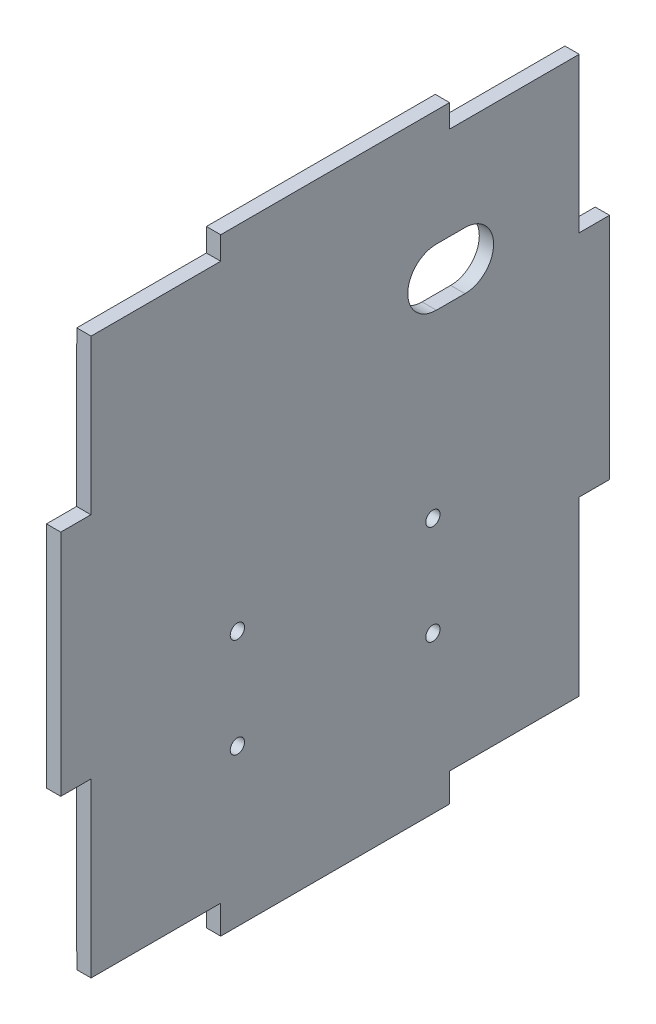
ISO-10303-21;
HEADER;
FILE_DESCRIPTION(('STEP AP214'),'2;1');
FILE_NAME('part.step','',(''),(''),'','','');
FILE_SCHEMA(('AUTOMOTIVE_DESIGN { 1 0 10303 214 1 1 1 1 }'));
ENDSEC;
DATA;
#1=APPLICATION_CONTEXT('core data for automotive mechanical design processes');
#2=APPLICATION_PROTOCOL_DEFINITION('international standard','automotive_design',2000,#1);
#3=PRODUCT_CONTEXT('',#1,'mechanical');
#4=PRODUCT('Part','Part','',(#3));
#5=PRODUCT_RELATED_PRODUCT_CATEGORY('part','',(#4));
#6=PRODUCT_DEFINITION_FORMATION('','',#4);
#7=PRODUCT_DEFINITION_CONTEXT('part definition',#1,'design');
#8=PRODUCT_DEFINITION('design','',#6,#7);
#9=PRODUCT_DEFINITION_SHAPE('','',#8);
#10=(LENGTH_UNIT() NAMED_UNIT(*) SI_UNIT(.MILLI.,.METRE.));
#11=(NAMED_UNIT(*) PLANE_ANGLE_UNIT() SI_UNIT($,.RADIAN.));
#12=(NAMED_UNIT(*) SI_UNIT($,.STERADIAN.) SOLID_ANGLE_UNIT());
#13=UNCERTAINTY_MEASURE_WITH_UNIT(LENGTH_MEASURE(1.E-05),#10,'distance_accuracy_value','');
#14=(GEOMETRIC_REPRESENTATION_CONTEXT(3) GLOBAL_UNCERTAINTY_ASSIGNED_CONTEXT((#13)) GLOBAL_UNIT_ASSIGNED_CONTEXT((#10,
#11,#12)) REPRESENTATION_CONTEXT('',''));
#15=CARTESIAN_POINT('',(0.,0.,0.));
#16=DIRECTION('',(0.,0.,1.));
#17=DIRECTION('',(1.,0.,0.));
#18=AXIS2_PLACEMENT_3D('',#15,#16,#17);
#19=CARTESIAN_POINT('',(377.825,0.066495814032682,54.1515274899939));
#20=DIRECTION('',(0.,0.00122795730759625,0.999999246060141));
#21=DIRECTION('',(0.,-0.999999246060141,0.00122795730759625));
#22=AXIS2_PLACEMENT_3D('',#19,#20,#21);
#23=PLANE('',#22);
#24=DIRECTION('',(0.,-0.999999246060141,0.00122795730759625));
#25=VECTOR('',#24,1.);
#26=CARTESIAN_POINT('',(381.,0.066495814032682,54.1515274899939));
#27=LINE('',#26,#25);
#28=CARTESIAN_POINT('',(381.,-19.5795814483705,54.1756520523223));
#29=VERTEX_POINT('',#28);
#30=CARTESIAN_POINT('',(381.,-53.8928809090593,54.2177873509103));
#31=VERTEX_POINT('',#30);
#32=EDGE_CURVE('E253',#29,#31,#27,.T.);
#33=ORIENTED_EDGE('',*,*,#32,.F.);
#34=DIRECTION('',(1.,0.,0.));
#35=VECTOR('',#34,1.);
#36=CARTESIAN_POINT('',(377.825,-19.5795814483705,54.1756520523223));
#37=LINE('',#36,#35);
#38=CARTESIAN_POINT('',(377.825,-19.5795814483705,54.1756520523223));
#39=VERTEX_POINT('',#38);
#40=EDGE_CURVE('E11',#39,#29,#37,.T.);
#41=ORIENTED_EDGE('',*,*,#40,.F.);
#42=DIRECTION('',(0.,-0.999999246060141,0.00122795730759625));
#43=VECTOR('',#42,1.);
#44=CARTESIAN_POINT('',(377.825,0.066495814032682,54.1515274899939));
#45=LINE('',#44,#43);
#46=CARTESIAN_POINT('',(377.825,-53.8928809090593,54.2177873509103));
#47=VERTEX_POINT('',#46);
#48=EDGE_CURVE('E391',#39,#47,#45,.T.);
#49=ORIENTED_EDGE('',*,*,#48,.T.);
#50=DIRECTION('',(1.,0.,0.));
#51=VECTOR('',#50,1.);
#52=CARTESIAN_POINT('',(377.825,-53.8928809090593,54.2177873509103));
#53=LINE('',#52,#51);
#54=EDGE_CURVE('E348',#47,#31,#53,.T.);
#55=ORIENTED_EDGE('',*,*,#54,.T.);
#56=EDGE_LOOP('',(#33,#41,#49,#55));
#57=FACE_BOUND('',#56,.T.);
#58=ADVANCED_FACE('F35',(#57),#23,.T.);
#59=CARTESIAN_POINT('',(377.825,-19.5795814483705,0.));
#60=DIRECTION('',(0.,-1.,0.));
#61=DIRECTION('',(0.,0.,-1.));
#62=AXIS2_PLACEMENT_3D('',#59,#60,#61);
#63=PLANE('',#62);
#64=DIRECTION('',(0.,0.,-1.));
#65=VECTOR('',#64,1.);
#66=CARTESIAN_POINT('',(381.,-19.5795814483705,0.));
#67=LINE('',#66,#65);
#68=CARTESIAN_POINT('',(381.,-19.5795814483705,25.4));
#69=VERTEX_POINT('',#68);
#70=EDGE_CURVE('E307',#29,#69,#67,.T.);
#71=ORIENTED_EDGE('',*,*,#70,.T.);
#72=DIRECTION('',(1.,0.,0.));
#73=VECTOR('',#72,1.);
#74=CARTESIAN_POINT('',(377.825,-19.5795814483705,25.4));
#75=LINE('',#74,#73);
#76=CARTESIAN_POINT('',(377.825,-19.5795814483705,25.4));
#77=VERTEX_POINT('',#76);
#78=EDGE_CURVE('E45',#77,#69,#75,.T.);
#79=ORIENTED_EDGE('',*,*,#78,.F.);
#80=DIRECTION('',(0.,0.,-1.));
#81=VECTOR('',#80,1.);
#82=CARTESIAN_POINT('',(377.825,-19.5795814483705,0.));
#83=LINE('',#82,#81);
#84=EDGE_CURVE('E213',#39,#77,#83,.T.);
#85=ORIENTED_EDGE('',*,*,#84,.F.);
#86=ORIENTED_EDGE('',*,*,#40,.T.);
#87=EDGE_LOOP('',(#71,#79,#85,#86));
#88=FACE_BOUND('',#87,.T.);
#89=ADVANCED_FACE('F488',(#88),#63,.F.);
#90=CARTESIAN_POINT('',(377.825,0.,25.4));
#91=DIRECTION('',(0.,0.,-1.));
#92=DIRECTION('',(-1.,0.,0.));
#93=AXIS2_PLACEMENT_3D('',#90,#91,#92);
#94=PLANE('',#93);
#95=DIRECTION('',(0.,1.,0.));
#96=VECTOR('',#95,1.);
#97=CARTESIAN_POINT('',(381.,0.,25.4));
#98=LINE('',#97,#96);
#99=CARTESIAN_POINT('',(381.,-14.4809573640672,25.4));
#100=VERTEX_POINT('',#99);
#101=EDGE_CURVE('E130',#69,#100,#98,.T.);
#102=ORIENTED_EDGE('',*,*,#101,.T.);
#103=DIRECTION('',(1.,0.,0.));
#104=VECTOR('',#103,1.);
#105=CARTESIAN_POINT('',(377.825,-14.4809573640672,25.4));
#106=LINE('',#105,#104);
#107=CARTESIAN_POINT('',(377.825,-14.4809573640672,25.4));
#108=VERTEX_POINT('',#107);
#109=EDGE_CURVE('E217',#108,#100,#106,.T.);
#110=ORIENTED_EDGE('',*,*,#109,.F.);
#111=DIRECTION('',(0.,1.,0.));
#112=VECTOR('',#111,1.);
#113=CARTESIAN_POINT('',(377.825,0.,25.4));
#114=LINE('',#113,#112);
#115=EDGE_CURVE('E205',#77,#108,#114,.T.);
#116=ORIENTED_EDGE('',*,*,#115,.F.);
#117=ORIENTED_EDGE('',*,*,#78,.T.);
#118=EDGE_LOOP('',(#102,#110,#116,#117));
#119=FACE_BOUND('',#118,.T.);
#120=ADVANCED_FACE('F218',(#119),#94,.F.);
#121=CARTESIAN_POINT('',(377.825,-14.4809573640672,0.));
#122=DIRECTION('',(0.,1.,0.));
#123=DIRECTION('',(0.,0.,1.));
#124=AXIS2_PLACEMENT_3D('',#121,#122,#123);
#125=PLANE('',#124);
#126=DIRECTION('',(0.,0.,1.));
#127=VECTOR('',#126,1.);
#128=CARTESIAN_POINT('',(381.,-14.4809573640672,0.));
#129=LINE('',#128,#127);
#130=CARTESIAN_POINT('',(381.,-14.4809573640672,-25.4));
#131=VERTEX_POINT('',#130);
#132=EDGE_CURVE('E304',#131,#100,#129,.T.);
#133=ORIENTED_EDGE('',*,*,#132,.F.);
#134=DIRECTION('',(1.,0.,0.));
#135=VECTOR('',#134,1.);
#136=CARTESIAN_POINT('',(377.825,-14.4809573640672,-25.4));
#137=LINE('',#136,#135);
#138=CARTESIAN_POINT('',(377.825,-14.4809573640672,-25.4));
#139=VERTEX_POINT('',#138);
#140=EDGE_CURVE('E221',#139,#131,#137,.T.);
#141=ORIENTED_EDGE('',*,*,#140,.F.);
#142=DIRECTION('',(0.,0.,1.));
#143=VECTOR('',#142,1.);
#144=CARTESIAN_POINT('',(377.825,-14.4809573640672,0.));
#145=LINE('',#144,#143);
#146=EDGE_CURVE('E211',#139,#108,#145,.T.);
#147=ORIENTED_EDGE('',*,*,#146,.T.);
#148=ORIENTED_EDGE('',*,*,#109,.T.);
#149=EDGE_LOOP('',(#133,#141,#147,#148));
#150=FACE_BOUND('',#149,.T.);
#151=ADVANCED_FACE('F223',(#150),#125,.T.);
#152=CARTESIAN_POINT('',(377.825,0.,-25.4));
#153=DIRECTION('',(0.,0.,-1.));
#154=DIRECTION('',(-1.,0.,0.));
#155=AXIS2_PLACEMENT_3D('',#152,#153,#154);
#156=PLANE('',#155);
#157=DIRECTION('',(0.,1.,0.));
#158=VECTOR('',#157,1.);
#159=CARTESIAN_POINT('',(381.,0.,-25.4));
#160=LINE('',#159,#158);
#161=CARTESIAN_POINT('',(381.,-19.5795814483705,-25.4));
#162=VERTEX_POINT('',#161);
#163=EDGE_CURVE('E301',#162,#131,#160,.T.);
#164=ORIENTED_EDGE('',*,*,#163,.F.);
#165=DIRECTION('',(1.,0.,0.));
#166=VECTOR('',#165,1.);
#167=CARTESIAN_POINT('',(377.825,-19.5795814483705,-25.4));
#168=LINE('',#167,#166);
#169=CARTESIAN_POINT('',(377.825,-19.5795814483705,-25.4));
#170=VERTEX_POINT('',#169);
#171=EDGE_CURVE('E312',#170,#162,#168,.T.);
#172=ORIENTED_EDGE('',*,*,#171,.F.);
#173=DIRECTION('',(0.,1.,0.));
#174=VECTOR('',#173,1.);
#175=CARTESIAN_POINT('',(377.825,0.,-25.4));
#176=LINE('',#175,#174);
#177=EDGE_CURVE('E224',#170,#139,#176,.T.);
#178=ORIENTED_EDGE('',*,*,#177,.T.);
#179=ORIENTED_EDGE('',*,*,#140,.T.);
#180=EDGE_LOOP('',(#164,#172,#178,#179));
#181=FACE_BOUND('',#180,.T.);
#182=ADVANCED_FACE('F502',(#181),#156,.T.);
#183=CARTESIAN_POINT('',(377.825,-19.5795814483705,0.));
#184=DIRECTION('',(0.,-1.,0.));
#185=DIRECTION('',(0.,0.,-1.));
#186=AXIS2_PLACEMENT_3D('',#183,#184,#185);
#187=PLANE('',#186);
#188=DIRECTION('',(0.,0.,-1.));
#189=VECTOR('',#188,1.);
#190=CARTESIAN_POINT('',(381.,-19.5795814483705,0.));
#191=LINE('',#190,#189);
#192=CARTESIAN_POINT('',(381.,-19.5795814483705,-54.1756520523224));
#193=VERTEX_POINT('',#192);
#194=EDGE_CURVE('E298',#162,#193,#191,.T.);
#195=ORIENTED_EDGE('',*,*,#194,.T.);
#196=DIRECTION('',(1.,0.,0.));
#197=VECTOR('',#196,1.);
#198=CARTESIAN_POINT('',(377.825,-19.5795814483705,-54.1756520523224));
#199=LINE('',#198,#197);
#200=CARTESIAN_POINT('',(377.825,-19.5795814483705,-54.1756520523224));
#201=VERTEX_POINT('',#200);
#202=EDGE_CURVE('E314',#201,#193,#199,.T.);
#203=ORIENTED_EDGE('',*,*,#202,.F.);
#204=DIRECTION('',(0.,0.,-1.));
#205=VECTOR('',#204,1.);
#206=CARTESIAN_POINT('',(377.825,-19.5795814483705,0.));
#207=LINE('',#206,#205);
#208=EDGE_CURVE('E226',#170,#201,#207,.T.);
#209=ORIENTED_EDGE('',*,*,#208,.F.);
#210=ORIENTED_EDGE('',*,*,#171,.T.);
#211=EDGE_LOOP('',(#195,#203,#209,#210));
#212=FACE_BOUND('',#211,.T.);
#213=ADVANCED_FACE('F436',(#212),#187,.F.);
#214=CARTESIAN_POINT('',(377.825,0.,-54.1756520523224));
#215=DIRECTION('',(0.,0.,1.));
#216=DIRECTION('',(0.,-1.,0.));
#217=AXIS2_PLACEMENT_3D('',#214,#215,#216);
#218=PLANE('',#217);
#219=DIRECTION('',(0.,-1.,0.));
#220=VECTOR('',#219,1.);
#221=CARTESIAN_POINT('',(381.,0.,-54.1756520523224));
#222=LINE('',#221,#220);
#223=CARTESIAN_POINT('',(381.,-53.8928809090593,-54.1756520523224));
#224=VERTEX_POINT('',#223);
#225=EDGE_CURVE('E295',#193,#224,#222,.T.);
#226=ORIENTED_EDGE('',*,*,#225,.T.);
#227=DIRECTION('',(1.,0.,0.));
#228=VECTOR('',#227,1.);
#229=CARTESIAN_POINT('',(377.825,-53.8928809090593,-54.1756520523224));
#230=LINE('',#229,#228);
#231=CARTESIAN_POINT('',(377.825,-53.8928809090593,-54.1756520523224));
#232=VERTEX_POINT('',#231);
#233=EDGE_CURVE('E317',#232,#224,#230,.T.);
#234=ORIENTED_EDGE('',*,*,#233,.F.);
#235=DIRECTION('',(0.,-1.,0.));
#236=VECTOR('',#235,1.);
#237=CARTESIAN_POINT('',(377.825,0.,-54.1756520523224));
#238=LINE('',#237,#236);
#239=EDGE_CURVE('E429',#201,#232,#238,.T.);
#240=ORIENTED_EDGE('',*,*,#239,.F.);
#241=ORIENTED_EDGE('',*,*,#202,.T.);
#242=EDGE_LOOP('',(#226,#234,#240,#241));
#243=FACE_BOUND('',#242,.T.);
#244=ADVANCED_FACE('F439',(#243),#218,.F.);
#245=CARTESIAN_POINT('',(377.825,-53.8928809090593,0.));
#246=DIRECTION('',(0.,-1.,0.));
#247=DIRECTION('',(0.,0.,-1.));
#248=AXIS2_PLACEMENT_3D('',#245,#246,#247);
#249=PLANE('',#248);
#250=DIRECTION('',(0.,0.,-1.));
#251=VECTOR('',#250,1.);
#252=CARTESIAN_POINT('',(381.,-53.8928809090593,0.));
#253=LINE('',#252,#251);
#254=CARTESIAN_POINT('',(381.,-53.8928809090593,-60.9022727272728));
#255=VERTEX_POINT('',#254);
#256=EDGE_CURVE('E292',#224,#255,#253,.T.);
#257=ORIENTED_EDGE('',*,*,#256,.T.);
#258=DIRECTION('',(1.,0.,0.));
#259=VECTOR('',#258,1.);
#260=CARTESIAN_POINT('',(377.825,-53.8928809090593,-60.9022727272728));
#261=LINE('',#260,#259);
#262=CARTESIAN_POINT('',(377.825,-53.8928809090593,-60.9022727272728));
#263=VERTEX_POINT('',#262);
#264=EDGE_CURVE('E320',#263,#255,#261,.T.);
#265=ORIENTED_EDGE('',*,*,#264,.F.);
#266=DIRECTION('',(0.,0.,-1.));
#267=VECTOR('',#266,1.);
#268=CARTESIAN_POINT('',(377.825,-53.8928809090593,0.));
#269=LINE('',#268,#267);
#270=EDGE_CURVE('E427',#232,#263,#269,.T.);
#271=ORIENTED_EDGE('',*,*,#270,.F.);
#272=ORIENTED_EDGE('',*,*,#233,.T.);
#273=EDGE_LOOP('',(#257,#265,#271,#272));
#274=FACE_BOUND('',#273,.T.);
#275=ADVANCED_FACE('F441',(#274),#249,.F.);
#276=CARTESIAN_POINT('',(377.825,0.,-60.9022727272728));
#277=DIRECTION('',(0.,0.,-1.));
#278=DIRECTION('',(0.,1.,0.));
#279=AXIS2_PLACEMENT_3D('',#276,#277,#278);
#280=PLANE('',#279);
#281=DIRECTION('',(0.,1.,0.));
#282=VECTOR('',#281,1.);
#283=CARTESIAN_POINT('',(381.,0.,-60.9022727272728));
#284=LINE('',#283,#282);
#285=CARTESIAN_POINT('',(381.,-104.692880909059,-60.9022727272728));
#286=VERTEX_POINT('',#285);
#287=EDGE_CURVE('E289',#286,#255,#284,.T.);
#288=ORIENTED_EDGE('',*,*,#287,.F.);
#289=DIRECTION('',(1.,0.,0.));
#290=VECTOR('',#289,1.);
#291=CARTESIAN_POINT('',(377.825,-104.692880909059,-60.9022727272728));
#292=LINE('',#291,#290);
#293=CARTESIAN_POINT('',(377.825,-104.692880909059,-60.9022727272728));
#294=VERTEX_POINT('',#293);
#295=EDGE_CURVE('E322',#294,#286,#292,.T.);
#296=ORIENTED_EDGE('',*,*,#295,.F.);
#297=DIRECTION('',(0.,1.,0.));
#298=VECTOR('',#297,1.);
#299=CARTESIAN_POINT('',(377.825,0.,-60.9022727272728));
#300=LINE('',#299,#298);
#301=EDGE_CURVE('E424',#294,#263,#300,.T.);
#302=ORIENTED_EDGE('',*,*,#301,.T.);
#303=ORIENTED_EDGE('',*,*,#264,.T.);
#304=EDGE_LOOP('',(#288,#296,#302,#303));
#305=FACE_BOUND('',#304,.T.);
#306=ADVANCED_FACE('F512',(#305),#280,.T.);
#307=CARTESIAN_POINT('',(377.825,-104.692880909059,0.));
#308=DIRECTION('',(0.,-1.,0.));
#309=DIRECTION('',(0.,0.,-1.));
#310=AXIS2_PLACEMENT_3D('',#307,#308,#309);
#311=PLANE('',#310);
#312=DIRECTION('',(0.,0.,-1.));
#313=VECTOR('',#312,1.);
#314=CARTESIAN_POINT('',(381.,-104.692880909059,0.));
#315=LINE('',#314,#313);
#316=CARTESIAN_POINT('',(381.,-104.692880909059,-54.1754914078006));
#317=VERTEX_POINT('',#316);
#318=EDGE_CURVE('E286',#317,#286,#315,.T.);
#319=ORIENTED_EDGE('',*,*,#318,.F.);
#320=DIRECTION('',(1.,0.,0.));
#321=VECTOR('',#320,1.);
#322=CARTESIAN_POINT('',(377.825,-104.692880909059,-54.1754914078006));
#323=LINE('',#322,#321);
#324=CARTESIAN_POINT('',(377.825,-104.692880909059,-54.1754914078006));
#325=VERTEX_POINT('',#324);
#326=EDGE_CURVE('E324',#325,#317,#323,.T.);
#327=ORIENTED_EDGE('',*,*,#326,.F.);
#328=DIRECTION('',(0.,0.,-1.));
#329=VECTOR('',#328,1.);
#330=CARTESIAN_POINT('',(377.825,-104.692880909059,0.));
#331=LINE('',#330,#329);
#332=EDGE_CURVE('E421',#325,#294,#331,.T.);
#333=ORIENTED_EDGE('',*,*,#332,.T.);
#334=ORIENTED_EDGE('',*,*,#295,.T.);
#335=EDGE_LOOP('',(#319,#327,#333,#334));
#336=FACE_BOUND('',#335,.T.);
#337=ADVANCED_FACE('F449',(#336),#311,.T.);
#338=CARTESIAN_POINT('',(377.825,0.,-54.1754914078006));
#339=DIRECTION('',(0.,0.,-1.));
#340=DIRECTION('',(-1.,0.,0.));
#341=AXIS2_PLACEMENT_3D('',#338,#339,#340);
#342=PLANE('',#341);
#343=DIRECTION('',(0.,1.,0.));
#344=VECTOR('',#343,1.);
#345=CARTESIAN_POINT('',(381.,0.,-54.1754914078006));
#346=LINE('',#345,#344);
#347=CARTESIAN_POINT('',(381.,-142.966383011379,-54.1754914078006));
#348=VERTEX_POINT('',#347);
#349=EDGE_CURVE('E283',#348,#317,#346,.T.);
#350=ORIENTED_EDGE('',*,*,#349,.F.);
#351=DIRECTION('',(1.,0.,0.));
#352=VECTOR('',#351,1.);
#353=CARTESIAN_POINT('',(377.825,-142.966383011379,-54.1754914078006));
#354=LINE('',#353,#352);
#355=CARTESIAN_POINT('',(377.825,-142.966383011379,-54.1754914078006));
#356=VERTEX_POINT('',#355);
#357=EDGE_CURVE('E326',#356,#348,#354,.T.);
#358=ORIENTED_EDGE('',*,*,#357,.F.);
#359=DIRECTION('',(0.,1.,0.));
#360=VECTOR('',#359,1.);
#361=CARTESIAN_POINT('',(377.825,0.,-54.1754914078006));
#362=LINE('',#361,#360);
#363=EDGE_CURVE('E418',#356,#325,#362,.T.);
#364=ORIENTED_EDGE('',*,*,#363,.T.);
#365=ORIENTED_EDGE('',*,*,#326,.T.);
#366=EDGE_LOOP('',(#350,#358,#364,#365));
#367=FACE_BOUND('',#366,.T.);
#368=ADVANCED_FACE('F453',(#367),#342,.T.);
#369=CARTESIAN_POINT('',(377.825,-142.966383011379,0.));
#370=DIRECTION('',(0.,1.,0.));
#371=DIRECTION('',(0.,0.,1.));
#372=AXIS2_PLACEMENT_3D('',#369,#370,#371);
#373=PLANE('',#372);
#374=DIRECTION('',(0.,0.,1.));
#375=VECTOR('',#374,1.);
#376=CARTESIAN_POINT('',(381.,-142.966383011379,0.));
#377=LINE('',#376,#375);
#378=CARTESIAN_POINT('',(381.,-142.966383011379,-25.4));
#379=VERTEX_POINT('',#378);
#380=EDGE_CURVE('E280',#348,#379,#377,.T.);
#381=ORIENTED_EDGE('',*,*,#380,.T.);
#382=DIRECTION('',(1.,0.,0.));
#383=VECTOR('',#382,1.);
#384=CARTESIAN_POINT('',(377.825,-142.966383011379,-25.4));
#385=LINE('',#384,#383);
#386=CARTESIAN_POINT('',(377.825,-142.966383011379,-25.4));
#387=VERTEX_POINT('',#386);
#388=EDGE_CURVE('E328',#387,#379,#385,.T.);
#389=ORIENTED_EDGE('',*,*,#388,.F.);
#390=DIRECTION('',(0.,0.,1.));
#391=VECTOR('',#390,1.);
#392=CARTESIAN_POINT('',(377.825,-142.966383011379,0.));
#393=LINE('',#392,#391);
#394=EDGE_CURVE('E415',#356,#387,#393,.T.);
#395=ORIENTED_EDGE('',*,*,#394,.F.);
#396=ORIENTED_EDGE('',*,*,#357,.T.);
#397=EDGE_LOOP('',(#381,#389,#395,#396));
#398=FACE_BOUND('',#397,.T.);
#399=ADVANCED_FACE('F458',(#398),#373,.F.);
#400=CARTESIAN_POINT('',(377.825,0.,-25.4));
#401=DIRECTION('',(0.,0.,1.));
#402=DIRECTION('',(1.,0.,0.));
#403=AXIS2_PLACEMENT_3D('',#400,#401,#402);
#404=PLANE('',#403);
#405=DIRECTION('',(0.,-1.,0.));
#406=VECTOR('',#405,1.);
#407=CARTESIAN_POINT('',(381.,0.,-25.4));
#408=LINE('',#407,#406);
#409=CARTESIAN_POINT('',(381.,-149.316383011379,-25.4));
#410=VERTEX_POINT('',#409);
#411=EDGE_CURVE('E277',#379,#410,#408,.T.);
#412=ORIENTED_EDGE('',*,*,#411,.T.);
#413=DIRECTION('',(1.,0.,0.));
#414=VECTOR('',#413,1.);
#415=CARTESIAN_POINT('',(377.825,-149.316383011379,-25.4));
#416=LINE('',#415,#414);
#417=CARTESIAN_POINT('',(377.825,-149.316383011379,-25.4));
#418=VERTEX_POINT('',#417);
#419=EDGE_CURVE('E331',#418,#410,#416,.T.);
#420=ORIENTED_EDGE('',*,*,#419,.F.);
#421=DIRECTION('',(0.,-1.,0.));
#422=VECTOR('',#421,1.);
#423=CARTESIAN_POINT('',(377.825,0.,-25.4));
#424=LINE('',#423,#422);
#425=EDGE_CURVE('E412',#387,#418,#424,.T.);
#426=ORIENTED_EDGE('',*,*,#425,.F.);
#427=ORIENTED_EDGE('',*,*,#388,.T.);
#428=EDGE_LOOP('',(#412,#420,#426,#427));
#429=FACE_BOUND('',#428,.T.);
#430=ADVANCED_FACE('F461',(#429),#404,.F.);
#431=CARTESIAN_POINT('',(377.825,-149.316383011379,0.));
#432=DIRECTION('',(0.,1.,0.));
#433=DIRECTION('',(0.,0.,1.));
#434=AXIS2_PLACEMENT_3D('',#431,#432,#433);
#435=PLANE('',#434);
#436=DIRECTION('',(0.,0.,1.));
#437=VECTOR('',#436,1.);
#438=CARTESIAN_POINT('',(381.,-149.316383011379,0.));
#439=LINE('',#438,#437);
#440=CARTESIAN_POINT('',(381.,-149.316383011379,25.4));
#441=VERTEX_POINT('',#440);
#442=EDGE_CURVE('E274',#410,#441,#439,.T.);
#443=ORIENTED_EDGE('',*,*,#442,.T.);
#444=DIRECTION('',(1.,0.,0.));
#445=VECTOR('',#444,1.);
#446=CARTESIAN_POINT('',(377.825,-149.316383011379,25.4));
#447=LINE('',#446,#445);
#448=CARTESIAN_POINT('',(377.825,-149.316383011379,25.4));
#449=VERTEX_POINT('',#448);
#450=EDGE_CURVE('E334',#449,#441,#447,.T.);
#451=ORIENTED_EDGE('',*,*,#450,.F.);
#452=DIRECTION('',(0.,0.,1.));
#453=VECTOR('',#452,1.);
#454=CARTESIAN_POINT('',(377.825,-149.316383011379,0.));
#455=LINE('',#454,#453);
#456=EDGE_CURVE('E410',#418,#449,#455,.T.);
#457=ORIENTED_EDGE('',*,*,#456,.F.);
#458=ORIENTED_EDGE('',*,*,#419,.T.);
#459=EDGE_LOOP('',(#443,#451,#457,#458));
#460=FACE_BOUND('',#459,.T.);
#461=ADVANCED_FACE('F463',(#460),#435,.F.);
#462=CARTESIAN_POINT('',(377.825,0.,25.4));
#463=DIRECTION('',(0.,0.,1.));
#464=DIRECTION('',(1.,0.,0.));
#465=AXIS2_PLACEMENT_3D('',#462,#463,#464);
#466=PLANE('',#465);
#467=DIRECTION('',(0.,-1.,0.));
#468=VECTOR('',#467,1.);
#469=CARTESIAN_POINT('',(381.,0.,25.4));
#470=LINE('',#469,#468);
#471=CARTESIAN_POINT('',(381.,-142.966383011379,25.4));
#472=VERTEX_POINT('',#471);
#473=EDGE_CURVE('E271',#472,#441,#470,.T.);
#474=ORIENTED_EDGE('',*,*,#473,.F.);
#475=DIRECTION('',(1.,0.,0.));
#476=VECTOR('',#475,1.);
#477=CARTESIAN_POINT('',(377.825,-142.966383011379,25.4));
#478=LINE('',#477,#476);
#479=CARTESIAN_POINT('',(377.825,-142.966383011379,25.4));
#480=VERTEX_POINT('',#479);
#481=EDGE_CURVE('E336',#480,#472,#478,.T.);
#482=ORIENTED_EDGE('',*,*,#481,.F.);
#483=DIRECTION('',(0.,-1.,0.));
#484=VECTOR('',#483,1.);
#485=CARTESIAN_POINT('',(377.825,0.,25.4));
#486=LINE('',#485,#484);
#487=EDGE_CURVE('E407',#480,#449,#486,.T.);
#488=ORIENTED_EDGE('',*,*,#487,.T.);
#489=ORIENTED_EDGE('',*,*,#450,.T.);
#490=EDGE_LOOP('',(#474,#482,#488,#489));
#491=FACE_BOUND('',#490,.T.);
#492=ADVANCED_FACE('F470',(#491),#466,.T.);
#493=CARTESIAN_POINT('',(377.825,-142.966383011379,0.));
#494=DIRECTION('',(0.,1.,0.));
#495=DIRECTION('',(0.,0.,1.));
#496=AXIS2_PLACEMENT_3D('',#493,#494,#495);
#497=PLANE('',#496);
#498=DIRECTION('',(0.,0.,1.));
#499=VECTOR('',#498,1.);
#500=CARTESIAN_POINT('',(381.,-142.966383011379,0.));
#501=LINE('',#500,#499);
#502=CARTESIAN_POINT('',(381.,-142.966383011379,54.1754914078005));
#503=VERTEX_POINT('',#502);
#504=EDGE_CURVE('E268',#472,#503,#501,.T.);
#505=ORIENTED_EDGE('',*,*,#504,.T.);
#506=DIRECTION('',(1.,0.,0.));
#507=VECTOR('',#506,1.);
#508=CARTESIAN_POINT('',(377.825,-142.966383011379,54.1754914078005));
#509=LINE('',#508,#507);
#510=CARTESIAN_POINT('',(377.825,-142.966383011379,54.1754914078005));
#511=VERTEX_POINT('',#510);
#512=EDGE_CURVE('E338',#511,#503,#509,.T.);
#513=ORIENTED_EDGE('',*,*,#512,.F.);
#514=DIRECTION('',(0.,0.,1.));
#515=VECTOR('',#514,1.);
#516=CARTESIAN_POINT('',(377.825,-142.966383011379,0.));
#517=LINE('',#516,#515);
#518=EDGE_CURVE('E404',#480,#511,#517,.T.);
#519=ORIENTED_EDGE('',*,*,#518,.F.);
#520=ORIENTED_EDGE('',*,*,#481,.T.);
#521=EDGE_LOOP('',(#505,#513,#519,#520));
#522=FACE_BOUND('',#521,.T.);
#523=ADVANCED_FACE('F473',(#522),#497,.F.);
#524=CARTESIAN_POINT('',(377.825,-0.0600437111925011,54.3334168148068));
#525=DIRECTION('',(0.,0.00110509660626167,-0.999999389380559));
#526=DIRECTION('',(0.,0.999999389380559,0.00110509660626167));
#527=AXIS2_PLACEMENT_3D('',#524,#525,#526);
#528=PLANE('',#527);
#529=DIRECTION('',(0.,0.999999389380559,0.00110509660626167));
#530=VECTOR('',#529,1.);
#531=CARTESIAN_POINT('',(381.,-0.0600437111925011,54.3334168148068));
#532=LINE('',#531,#530);
#533=CARTESIAN_POINT('',(381.,-104.692880909059,54.2177873509103));
#534=VERTEX_POINT('',#533);
#535=EDGE_CURVE('E265',#503,#534,#532,.T.);
#536=ORIENTED_EDGE('',*,*,#535,.T.);
#537=DIRECTION('',(1.,0.,0.));
#538=VECTOR('',#537,1.);
#539=CARTESIAN_POINT('',(377.825,-104.692880909059,54.2177873509103));
#540=LINE('',#539,#538);
#541=CARTESIAN_POINT('',(377.825,-104.692880909059,54.2177873509103));
#542=VERTEX_POINT('',#541);
#543=EDGE_CURVE('E341',#542,#534,#540,.T.);
#544=ORIENTED_EDGE('',*,*,#543,.F.);
#545=DIRECTION('',(0.,0.999999389380559,0.00110509660626167));
#546=VECTOR('',#545,1.);
#547=CARTESIAN_POINT('',(377.825,-0.0600437111925011,54.3334168148068));
#548=LINE('',#547,#546);
#549=EDGE_CURVE('E401',#511,#542,#548,.T.);
#550=ORIENTED_EDGE('',*,*,#549,.F.);
#551=ORIENTED_EDGE('',*,*,#512,.T.);
#552=EDGE_LOOP('',(#536,#544,#550,#551));
#553=FACE_BOUND('',#552,.T.);
#554=ADVANCED_FACE('F475',(#553),#528,.F.);
#555=CARTESIAN_POINT('',(377.825,-104.692880909059,0.));
#556=DIRECTION('',(0.,1.,0.));
#557=DIRECTION('',(0.,0.,1.));
#558=AXIS2_PLACEMENT_3D('',#555,#556,#557);
#559=PLANE('',#558);
#560=DIRECTION('',(0.,0.,1.));
#561=VECTOR('',#560,1.);
#562=CARTESIAN_POINT('',(381.,-104.692880909059,0.));
#563=LINE('',#562,#561);
#564=CARTESIAN_POINT('',(381.,-104.692880909059,60.9022727272727));
#565=VERTEX_POINT('',#564);
#566=EDGE_CURVE('E262',#534,#565,#563,.T.);
#567=ORIENTED_EDGE('',*,*,#566,.T.);
#568=DIRECTION('',(1.,0.,0.));
#569=VECTOR('',#568,1.);
#570=CARTESIAN_POINT('',(377.825,-104.692880909059,60.9022727272727));
#571=LINE('',#570,#569);
#572=CARTESIAN_POINT('',(377.825,-104.692880909059,60.9022727272727));
#573=VERTEX_POINT('',#572);
#574=EDGE_CURVE('E344',#573,#565,#571,.T.);
#575=ORIENTED_EDGE('',*,*,#574,.F.);
#576=DIRECTION('',(0.,0.,1.));
#577=VECTOR('',#576,1.);
#578=CARTESIAN_POINT('',(377.825,-104.692880909059,0.));
#579=LINE('',#578,#577);
#580=EDGE_CURVE('E399',#542,#573,#579,.T.);
#581=ORIENTED_EDGE('',*,*,#580,.F.);
#582=ORIENTED_EDGE('',*,*,#543,.T.);
#583=EDGE_LOOP('',(#567,#575,#581,#582));
#584=FACE_BOUND('',#583,.T.);
#585=ADVANCED_FACE('F481',(#584),#559,.F.);
#586=CARTESIAN_POINT('',(377.825,0.,60.9022727272727));
#587=DIRECTION('',(0.,0.,1.));
#588=DIRECTION('',(0.,-1.,0.));
#589=AXIS2_PLACEMENT_3D('',#586,#587,#588);
#590=PLANE('',#589);
#591=DIRECTION('',(0.,-1.,0.));
#592=VECTOR('',#591,1.);
#593=CARTESIAN_POINT('',(381.,0.,60.9022727272727));
#594=LINE('',#593,#592);
#595=CARTESIAN_POINT('',(381.,-53.8928809090593,60.9022727272727));
#596=VERTEX_POINT('',#595);
#597=EDGE_CURVE('E259',#596,#565,#594,.T.);
#598=ORIENTED_EDGE('',*,*,#597,.F.);
#599=DIRECTION('',(1.,0.,0.));
#600=VECTOR('',#599,1.);
#601=CARTESIAN_POINT('',(377.825,-53.8928809090593,60.9022727272727));
#602=LINE('',#601,#600);
#603=CARTESIAN_POINT('',(377.825,-53.8928809090593,60.9022727272727));
#604=VERTEX_POINT('',#603);
#605=EDGE_CURVE('E346',#604,#596,#602,.T.);
#606=ORIENTED_EDGE('',*,*,#605,.F.);
#607=DIRECTION('',(0.,-1.,0.));
#608=VECTOR('',#607,1.);
#609=CARTESIAN_POINT('',(377.825,0.,60.9022727272727));
#610=LINE('',#609,#608);
#611=EDGE_CURVE('E396',#604,#573,#610,.T.);
#612=ORIENTED_EDGE('',*,*,#611,.T.);
#613=ORIENTED_EDGE('',*,*,#574,.T.);
#614=EDGE_LOOP('',(#598,#606,#612,#613));
#615=FACE_BOUND('',#614,.T.);
#616=ADVANCED_FACE('F484',(#615),#590,.T.);
#617=CARTESIAN_POINT('',(377.825,-46.5654427404296,-28.8177873509104));
#618=DIRECTION('',(1.,0.,0.));
#619=DIRECTION('',(0.,0.,-1.));
#620=AXIS2_PLACEMENT_3D('',#617,#618,#619);
#621=CYLINDRICAL_SURFACE('',#620,6.34999999999999);
#622=CARTESIAN_POINT('',(381.,-46.5654427404296,-28.8177873509104));
#623=DIRECTION('',(1.,0.,0.));
#624=DIRECTION('',(0.,0.,-1.));
#625=AXIS2_PLACEMENT_3D('',#622,#623,#624);
#626=CIRCLE('',#625,6.34999999999999);
#627=CARTESIAN_POINT('',(381.,-52.9154427404296,-28.8177873509104));
#628=VERTEX_POINT('',#627);
#629=CARTESIAN_POINT('',(381.,-40.2154427404296,-28.8177873509104));
#630=VERTEX_POINT('',#629);
#631=EDGE_CURVE('E231',#628,#630,#626,.T.);
#632=ORIENTED_EDGE('',*,*,#631,.T.);
#633=DIRECTION('',(1.,0.,0.));
#634=VECTOR('',#633,1.);
#635=CARTESIAN_POINT('',(377.825,-40.2154427404296,-28.8177873509104));
#636=LINE('',#635,#634);
#637=CARTESIAN_POINT('',(377.825,-40.2154427404296,-28.8177873509104));
#638=VERTEX_POINT('',#637);
#639=EDGE_CURVE('E350',#638,#630,#636,.T.);
#640=ORIENTED_EDGE('',*,*,#639,.F.);
#641=CARTESIAN_POINT('',(377.825,-46.5654427404296,-28.8177873509104));
#642=DIRECTION('',(1.,0.,0.));
#643=DIRECTION('',(0.,0.,-1.));
#644=AXIS2_PLACEMENT_3D('',#641,#642,#643);
#645=CIRCLE('',#644,6.34999999999999);
#646=CARTESIAN_POINT('',(377.825,-52.9154427404296,-28.8177873509104));
#647=VERTEX_POINT('',#646);
#648=EDGE_CURVE('E308',#647,#638,#645,.T.);
#649=ORIENTED_EDGE('',*,*,#648,.F.);
#650=DIRECTION('',(1.,0.,0.));
#651=VECTOR('',#650,1.);
#652=CARTESIAN_POINT('',(377.825,-52.9154427404296,-28.8177873509104));
#653=LINE('',#652,#651);
#654=EDGE_CURVE('E39',#647,#628,#653,.T.);
#655=ORIENTED_EDGE('',*,*,#654,.T.);
#656=EDGE_LOOP('',(#632,#640,#649,#655));
#657=FACE_BOUND('',#656,.T.);
#658=ADVANCED_FACE('F37',(#657),#621,.F.);
#659=CARTESIAN_POINT('',(377.825,-40.2154427404296,0.));
#660=DIRECTION('',(0.,-1.,0.));
#661=DIRECTION('',(0.,0.,-1.));
#662=AXIS2_PLACEMENT_3D('',#659,#660,#661);
#663=PLANE('',#662);
#664=DIRECTION('',(0.,0.,-1.));
#665=VECTOR('',#664,1.);
#666=CARTESIAN_POINT('',(381.,-40.2154427404296,0.));
#667=LINE('',#666,#665);
#668=CARTESIAN_POINT('',(381.,-40.2154427404296,-22.4677873509104));
#669=VERTEX_POINT('',#668);
#670=EDGE_CURVE('E238',#669,#630,#667,.T.);
#671=ORIENTED_EDGE('',*,*,#670,.F.);
#672=DIRECTION('',(1.,0.,0.));
#673=VECTOR('',#672,1.);
#674=CARTESIAN_POINT('',(377.825,-40.2154427404296,-22.4677873509104));
#675=LINE('',#674,#673);
#676=CARTESIAN_POINT('',(377.825,-40.2154427404296,-22.4677873509104));
#677=VERTEX_POINT('',#676);
#678=EDGE_CURVE('E352',#677,#669,#675,.T.);
#679=ORIENTED_EDGE('',*,*,#678,.F.);
#680=DIRECTION('',(0.,0.,-1.));
#681=VECTOR('',#680,1.);
#682=CARTESIAN_POINT('',(377.825,-40.2154427404296,0.));
#683=LINE('',#682,#681);
#684=EDGE_CURVE('E373',#677,#638,#683,.T.);
#685=ORIENTED_EDGE('',*,*,#684,.T.);
#686=ORIENTED_EDGE('',*,*,#639,.T.);
#687=EDGE_LOOP('',(#671,#679,#685,#686));
#688=FACE_BOUND('',#687,.T.);
#689=ADVANCED_FACE('F369',(#688),#663,.T.);
#690=CARTESIAN_POINT('',(377.825,-46.5654427404296,-22.4677873509104));
#691=DIRECTION('',(1.,0.,0.));
#692=DIRECTION('',(0.,0.,-1.));
#693=AXIS2_PLACEMENT_3D('',#690,#691,#692);
#694=CYLINDRICAL_SURFACE('',#693,6.34999999999999);
#695=CARTESIAN_POINT('',(381.,-46.5654427404296,-22.4677873509104));
#696=DIRECTION('',(1.,0.,0.));
#697=DIRECTION('',(0.,0.,-1.));
#698=AXIS2_PLACEMENT_3D('',#695,#696,#697);
#699=CIRCLE('',#698,6.34999999999999);
#700=CARTESIAN_POINT('',(381.,-52.9154427404296,-22.4677873509104));
#701=VERTEX_POINT('',#700);
#702=EDGE_CURVE('E236',#669,#701,#699,.T.);
#703=ORIENTED_EDGE('',*,*,#702,.T.);
#704=DIRECTION('',(1.,0.,0.));
#705=VECTOR('',#704,1.);
#706=CARTESIAN_POINT('',(377.825,-52.9154427404296,-22.4677873509104));
#707=LINE('',#706,#705);
#708=CARTESIAN_POINT('',(377.825,-52.9154427404296,-22.4677873509104));
#709=VERTEX_POINT('',#708);
#710=EDGE_CURVE('E353',#709,#701,#707,.T.);
#711=ORIENTED_EDGE('',*,*,#710,.F.);
#712=CARTESIAN_POINT('',(377.825,-46.5654427404296,-22.4677873509104));
#713=DIRECTION('',(1.,0.,0.));
#714=DIRECTION('',(0.,0.,-1.));
#715=AXIS2_PLACEMENT_3D('',#712,#713,#714);
#716=CIRCLE('',#715,6.34999999999999);
#717=EDGE_CURVE('E375',#677,#709,#716,.T.);
#718=ORIENTED_EDGE('',*,*,#717,.F.);
#719=ORIENTED_EDGE('',*,*,#678,.T.);
#720=EDGE_LOOP('',(#703,#711,#718,#719));
#721=FACE_BOUND('',#720,.T.);
#722=ADVANCED_FACE('F542',(#721),#694,.F.);
#723=CARTESIAN_POINT('',(377.825,-114.617733912439,21.7));
#724=DIRECTION('',(1.,0.,0.));
#725=DIRECTION('',(0.,0.,-1.));
#726=AXIS2_PLACEMENT_3D('',#723,#724,#725);
#727=CYLINDRICAL_SURFACE('',#726,1.5875);
#728=CARTESIAN_POINT('',(377.825,-114.617733912439,21.7));
#729=DIRECTION('',(1.,0.,0.));
#730=DIRECTION('',(0.,0.,-1.));
#731=AXIS2_PLACEMENT_3D('',#728,#729,#730);
#732=CIRCLE('',#731,1.5875);
#733=CARTESIAN_POINT('',(377.825,-114.617733912439,20.1125));
#734=VERTEX_POINT('',#733);
#735=EDGE_CURVE('E388',#734,#734,#732,.T.);
#736=ORIENTED_EDGE('',*,*,#735,.F.);
#737=EDGE_LOOP('',(#736));
#738=FACE_BOUND('',#737,.T.);
#739=CARTESIAN_POINT('',(381.,-114.617733912439,21.7));
#740=DIRECTION('',(1.,0.,0.));
#741=DIRECTION('',(0.,0.,-1.));
#742=AXIS2_PLACEMENT_3D('',#739,#740,#741);
#743=CIRCLE('',#742,1.5875);
#744=CARTESIAN_POINT('',(381.,-114.617733912439,20.1125));
#745=VERTEX_POINT('',#744);
#746=EDGE_CURVE('E250',#745,#745,#743,.T.);
#747=ORIENTED_EDGE('',*,*,#746,.T.);
#748=EDGE_LOOP('',(#747));
#749=FACE_BOUND('',#748,.T.);
#750=ADVANCED_FACE('F538',(#738,#749),#727,.F.);
#751=CARTESIAN_POINT('',(377.825,-114.617733912439,-21.7));
#752=DIRECTION('',(1.,0.,0.));
#753=DIRECTION('',(0.,0.,-1.));
#754=AXIS2_PLACEMENT_3D('',#751,#752,#753);
#755=CYLINDRICAL_SURFACE('',#754,1.5875);
#756=CARTESIAN_POINT('',(377.825,-114.617733912439,-21.7));
#757=DIRECTION('',(1.,0.,0.));
#758=DIRECTION('',(0.,0.,-1.));
#759=AXIS2_PLACEMENT_3D('',#756,#757,#758);
#760=CIRCLE('',#759,1.5875);
#761=CARTESIAN_POINT('',(377.825,-114.617733912439,-23.2875));
#762=VERTEX_POINT('',#761);
#763=EDGE_CURVE('E385',#762,#762,#760,.T.);
#764=ORIENTED_EDGE('',*,*,#763,.F.);
#765=EDGE_LOOP('',(#764));
#766=FACE_BOUND('',#765,.T.);
#767=CARTESIAN_POINT('',(381.,-114.617733912439,-21.7));
#768=DIRECTION('',(1.,0.,0.));
#769=DIRECTION('',(0.,0.,-1.));
#770=AXIS2_PLACEMENT_3D('',#767,#768,#769);
#771=CIRCLE('',#770,1.5875);
#772=CARTESIAN_POINT('',(381.,-114.617733912439,-23.2875));
#773=VERTEX_POINT('',#772);
#774=EDGE_CURVE('E247',#773,#773,#771,.T.);
#775=ORIENTED_EDGE('',*,*,#774,.T.);
#776=EDGE_LOOP('',(#775));
#777=FACE_BOUND('',#776,.T.);
#778=ADVANCED_FACE('F541',(#766,#777),#755,.F.);
#779=CARTESIAN_POINT('',(377.825,-92.5377339124392,-21.7));
#780=DIRECTION('',(1.,0.,0.));
#781=DIRECTION('',(0.,0.,-1.));
#782=AXIS2_PLACEMENT_3D('',#779,#780,#781);
#783=CYLINDRICAL_SURFACE('',#782,1.5875);
#784=CARTESIAN_POINT('',(377.825,-92.5377339124392,-21.7));
#785=DIRECTION('',(1.,0.,0.));
#786=DIRECTION('',(0.,0.,-1.));
#787=AXIS2_PLACEMENT_3D('',#784,#785,#786);
#788=CIRCLE('',#787,1.5875);
#789=CARTESIAN_POINT('',(377.825,-92.5377339124392,-23.2875));
#790=VERTEX_POINT('',#789);
#791=EDGE_CURVE('E378',#790,#790,#788,.T.);
#792=ORIENTED_EDGE('',*,*,#791,.F.);
#793=EDGE_LOOP('',(#792));
#794=FACE_BOUND('',#793,.T.);
#795=CARTESIAN_POINT('',(381.,-92.5377339124392,-21.7));
#796=DIRECTION('',(1.,0.,0.));
#797=DIRECTION('',(0.,0.,-1.));
#798=AXIS2_PLACEMENT_3D('',#795,#796,#797);
#799=CIRCLE('',#798,1.5875);
#800=CARTESIAN_POINT('',(381.,-92.5377339124392,-23.2875));
#801=VERTEX_POINT('',#800);
#802=EDGE_CURVE('E244',#801,#801,#799,.T.);
#803=ORIENTED_EDGE('',*,*,#802,.T.);
#804=EDGE_LOOP('',(#803));
#805=FACE_BOUND('',#804,.T.);
#806=ADVANCED_FACE('F546',(#794,#805),#783,.F.);
#807=CARTESIAN_POINT('',(377.825,-92.5377339124392,21.7));
#808=DIRECTION('',(1.,0.,0.));
#809=DIRECTION('',(0.,0.,-1.));
#810=AXIS2_PLACEMENT_3D('',#807,#808,#809);
#811=CYLINDRICAL_SURFACE('',#810,1.5875);
#812=CARTESIAN_POINT('',(377.825,-92.5377339124392,21.7));
#813=DIRECTION('',(1.,0.,0.));
#814=DIRECTION('',(0.,0.,-1.));
#815=AXIS2_PLACEMENT_3D('',#812,#813,#814);
#816=CIRCLE('',#815,1.5875);
#817=CARTESIAN_POINT('',(377.825,-92.5377339124392,20.1125));
#818=VERTEX_POINT('',#817);
#819=EDGE_CURVE('E374',#818,#818,#816,.T.);
#820=ORIENTED_EDGE('',*,*,#819,.F.);
#821=EDGE_LOOP('',(#820));
#822=FACE_BOUND('',#821,.T.);
#823=CARTESIAN_POINT('',(381.,-92.5377339124392,21.7));
#824=DIRECTION('',(1.,0.,0.));
#825=DIRECTION('',(0.,0.,-1.));
#826=AXIS2_PLACEMENT_3D('',#823,#824,#825);
#827=CIRCLE('',#826,1.5875);
#828=CARTESIAN_POINT('',(381.,-92.5377339124392,20.1125));
#829=VERTEX_POINT('',#828);
#830=EDGE_CURVE('E241',#829,#829,#827,.T.);
#831=ORIENTED_EDGE('',*,*,#830,.T.);
#832=EDGE_LOOP('',(#831));
#833=FACE_BOUND('',#832,.T.);
#834=ADVANCED_FACE('F550',(#822,#833),#811,.F.);
#835=CARTESIAN_POINT('',(377.825,-52.9154427404296,0.));
#836=DIRECTION('',(0.,-1.,0.));
#837=DIRECTION('',(0.,0.,-1.));
#838=AXIS2_PLACEMENT_3D('',#835,#836,#837);
#839=PLANE('',#838);
#840=DIRECTION('',(0.,0.,-1.));
#841=VECTOR('',#840,1.);
#842=CARTESIAN_POINT('',(381.,-52.9154427404296,0.));
#843=LINE('',#842,#841);
#844=EDGE_CURVE('E234',#701,#628,#843,.T.);
#845=ORIENTED_EDGE('',*,*,#844,.T.);
#846=ORIENTED_EDGE('',*,*,#654,.F.);
#847=DIRECTION('',(0.,0.,-1.));
#848=VECTOR('',#847,1.);
#849=CARTESIAN_POINT('',(377.825,-52.9154427404296,0.));
#850=LINE('',#849,#848);
#851=EDGE_CURVE('E142',#709,#647,#850,.T.);
#852=ORIENTED_EDGE('',*,*,#851,.F.);
#853=ORIENTED_EDGE('',*,*,#710,.T.);
#854=EDGE_LOOP('',(#845,#846,#852,#853));
#855=FACE_BOUND('',#854,.T.);
#856=ADVANCED_FACE('F536',(#855),#839,.F.);
#857=CARTESIAN_POINT('',(377.825,-53.8928809090593,0.));
#858=DIRECTION('',(0.,1.,0.));
#859=DIRECTION('',(0.,0.,1.));
#860=AXIS2_PLACEMENT_3D('',#857,#858,#859);
#861=PLANE('',#860);
#862=DIRECTION('',(0.,0.,1.));
#863=VECTOR('',#862,1.);
#864=CARTESIAN_POINT('',(381.,-53.8928809090593,0.));
#865=LINE('',#864,#863);
#866=EDGE_CURVE('E256',#31,#596,#865,.T.);
#867=ORIENTED_EDGE('',*,*,#866,.F.);
#868=ORIENTED_EDGE('',*,*,#54,.F.);
#869=DIRECTION('',(0.,0.,1.));
#870=VECTOR('',#869,1.);
#871=CARTESIAN_POINT('',(377.825,-53.8928809090593,0.));
#872=LINE('',#871,#870);
#873=EDGE_CURVE('E393',#47,#604,#872,.T.);
#874=ORIENTED_EDGE('',*,*,#873,.T.);
#875=ORIENTED_EDGE('',*,*,#605,.T.);
#876=EDGE_LOOP('',(#867,#868,#874,#875));
#877=FACE_BOUND('',#876,.T.);
#878=ADVANCED_FACE('F487',(#877),#861,.T.);
#879=CARTESIAN_POINT('',(377.825,0.,0.));
#880=DIRECTION('',(1.,0.,0.));
#881=DIRECTION('',(0.,0.,-1.));
#882=AXIS2_PLACEMENT_3D('',#879,#880,#881);
#883=PLANE('',#882);
#884=ORIENTED_EDGE('',*,*,#648,.T.);
#885=ORIENTED_EDGE('',*,*,#684,.F.);
#886=ORIENTED_EDGE('',*,*,#717,.T.);
#887=ORIENTED_EDGE('',*,*,#851,.T.);
#888=EDGE_LOOP('',(#884,#885,#886,#887));
#889=FACE_BOUND('',#888,.T.);
#890=ORIENTED_EDGE('',*,*,#819,.T.);
#891=EDGE_LOOP('',(#890));
#892=FACE_BOUND('',#891,.T.);
#893=ORIENTED_EDGE('',*,*,#791,.T.);
#894=EDGE_LOOP('',(#893));
#895=FACE_BOUND('',#894,.T.);
#896=ORIENTED_EDGE('',*,*,#763,.T.);
#897=EDGE_LOOP('',(#896));
#898=FACE_BOUND('',#897,.T.);
#899=ORIENTED_EDGE('',*,*,#735,.T.);
#900=EDGE_LOOP('',(#899));
#901=FACE_BOUND('',#900,.T.);
#902=ORIENTED_EDGE('',*,*,#48,.F.);
#903=ORIENTED_EDGE('',*,*,#84,.T.);
#904=ORIENTED_EDGE('',*,*,#115,.T.);
#905=ORIENTED_EDGE('',*,*,#146,.F.);
#906=ORIENTED_EDGE('',*,*,#177,.F.);
#907=ORIENTED_EDGE('',*,*,#208,.T.);
#908=ORIENTED_EDGE('',*,*,#239,.T.);
#909=ORIENTED_EDGE('',*,*,#270,.T.);
#910=ORIENTED_EDGE('',*,*,#301,.F.);
#911=ORIENTED_EDGE('',*,*,#332,.F.);
#912=ORIENTED_EDGE('',*,*,#363,.F.);
#913=ORIENTED_EDGE('',*,*,#394,.T.);
#914=ORIENTED_EDGE('',*,*,#425,.T.);
#915=ORIENTED_EDGE('',*,*,#456,.T.);
#916=ORIENTED_EDGE('',*,*,#487,.F.);
#917=ORIENTED_EDGE('',*,*,#518,.T.);
#918=ORIENTED_EDGE('',*,*,#549,.T.);
#919=ORIENTED_EDGE('',*,*,#580,.T.);
#920=ORIENTED_EDGE('',*,*,#611,.F.);
#921=ORIENTED_EDGE('',*,*,#873,.F.);
#922=EDGE_LOOP('',(#902,#903,#904,#905,#906,#907,#908,#909,#910,#911,#912,#913,#914,#915,#916,
#917,#918,#919,#920,#921));
#923=FACE_BOUND('',#922,.T.);
#924=ADVANCED_FACE('F208',(#889,#892,#895,#898,#901,#923),#883,.F.);
#925=CARTESIAN_POINT('',(381.,0.,0.));
#926=DIRECTION('',(1.,0.,0.));
#927=DIRECTION('',(0.,0.,-1.));
#928=AXIS2_PLACEMENT_3D('',#925,#926,#927);
#929=PLANE('',#928);
#930=ORIENTED_EDGE('',*,*,#631,.F.);
#931=ORIENTED_EDGE('',*,*,#844,.F.);
#932=ORIENTED_EDGE('',*,*,#702,.F.);
#933=ORIENTED_EDGE('',*,*,#670,.T.);
#934=EDGE_LOOP('',(#930,#931,#932,#933));
#935=FACE_BOUND('',#934,.T.);
#936=ORIENTED_EDGE('',*,*,#830,.F.);
#937=EDGE_LOOP('',(#936));
#938=FACE_BOUND('',#937,.T.);
#939=ORIENTED_EDGE('',*,*,#802,.F.);
#940=EDGE_LOOP('',(#939));
#941=FACE_BOUND('',#940,.T.);
#942=ORIENTED_EDGE('',*,*,#774,.F.);
#943=EDGE_LOOP('',(#942));
#944=FACE_BOUND('',#943,.T.);
#945=ORIENTED_EDGE('',*,*,#746,.F.);
#946=EDGE_LOOP('',(#945));
#947=FACE_BOUND('',#946,.T.);
#948=ORIENTED_EDGE('',*,*,#32,.T.);
#949=ORIENTED_EDGE('',*,*,#866,.T.);
#950=ORIENTED_EDGE('',*,*,#597,.T.);
#951=ORIENTED_EDGE('',*,*,#566,.F.);
#952=ORIENTED_EDGE('',*,*,#535,.F.);
#953=ORIENTED_EDGE('',*,*,#504,.F.);
#954=ORIENTED_EDGE('',*,*,#473,.T.);
#955=ORIENTED_EDGE('',*,*,#442,.F.);
#956=ORIENTED_EDGE('',*,*,#411,.F.);
#957=ORIENTED_EDGE('',*,*,#380,.F.);
#958=ORIENTED_EDGE('',*,*,#349,.T.);
#959=ORIENTED_EDGE('',*,*,#318,.T.);
#960=ORIENTED_EDGE('',*,*,#287,.T.);
#961=ORIENTED_EDGE('',*,*,#256,.F.);
#962=ORIENTED_EDGE('',*,*,#225,.F.);
#963=ORIENTED_EDGE('',*,*,#194,.F.);
#964=ORIENTED_EDGE('',*,*,#163,.T.);
#965=ORIENTED_EDGE('',*,*,#132,.T.);
#966=ORIENTED_EDGE('',*,*,#101,.F.);
#967=ORIENTED_EDGE('',*,*,#70,.F.);
#968=EDGE_LOOP('',(#948,#949,#950,#951,#952,#953,#954,#955,#956,#957,#958,#959,#960,#961,#962,
#963,#964,#965,#966,#967));
#969=FACE_BOUND('',#968,.T.);
#970=ADVANCED_FACE('F364',(#935,#938,#941,#944,#947,#969),#929,.T.);
#971=CLOSED_SHELL('',(#58,#89,#120,#151,#182,#213,#244,#275,#306,#337,#368,#399,#430,#461,#492,
#523,#554,#585,#616,#658,#689,#722,#750,#778,#806,#834,#856,#878,#924,#970));
#972=MANIFOLD_SOLID_BREP('B2',#971);
#973=ADVANCED_BREP_SHAPE_REPRESENTATION('',(#18,#972),#14);
#974=SHAPE_DEFINITION_REPRESENTATION(#9,#973);
ENDSEC;
END-ISO-10303-21;
